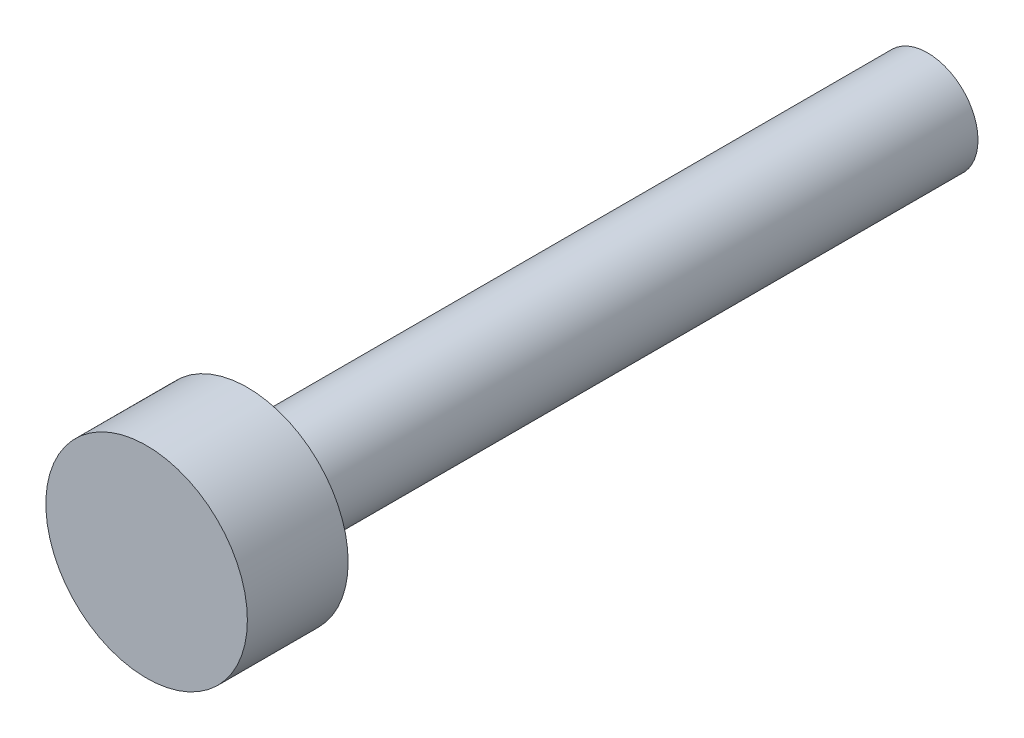
ISO-10303-21;
HEADER;
FILE_DESCRIPTION(('STEP AP214'),'2;1');
FILE_NAME('part.step','',(''),(''),'','','');
FILE_SCHEMA(('AUTOMOTIVE_DESIGN { 1 0 10303 214 1 1 1 1 }'));
ENDSEC;
DATA;
#1=APPLICATION_CONTEXT('core data for automotive mechanical design processes');
#2=APPLICATION_PROTOCOL_DEFINITION('international standard','automotive_design',2000,#1);
#3=PRODUCT_CONTEXT('',#1,'mechanical');
#4=PRODUCT('Part','Part','',(#3));
#5=PRODUCT_RELATED_PRODUCT_CATEGORY('part','',(#4));
#6=PRODUCT_DEFINITION_FORMATION('','',#4);
#7=PRODUCT_DEFINITION_CONTEXT('part definition',#1,'design');
#8=PRODUCT_DEFINITION('design','',#6,#7);
#9=PRODUCT_DEFINITION_SHAPE('','',#8);
#10=(LENGTH_UNIT() NAMED_UNIT(*) SI_UNIT(.MILLI.,.METRE.));
#11=(NAMED_UNIT(*) PLANE_ANGLE_UNIT() SI_UNIT($,.RADIAN.));
#12=(NAMED_UNIT(*) SI_UNIT($,.STERADIAN.) SOLID_ANGLE_UNIT());
#13=UNCERTAINTY_MEASURE_WITH_UNIT(LENGTH_MEASURE(1.E-05),#10,'distance_accuracy_value','');
#14=(GEOMETRIC_REPRESENTATION_CONTEXT(3) GLOBAL_UNCERTAINTY_ASSIGNED_CONTEXT((#13)) GLOBAL_UNIT_ASSIGNED_CONTEXT((#10,
#11,#12)) REPRESENTATION_CONTEXT('',''));
#15=CARTESIAN_POINT('',(0.,0.,0.));
#16=DIRECTION('',(0.,0.,1.));
#17=DIRECTION('',(1.,0.,0.));
#18=AXIS2_PLACEMENT_3D('',#15,#16,#17);
#19=CARTESIAN_POINT('',(0.,0.,27.));
#20=DIRECTION('',(0.,0.,-1.));
#21=DIRECTION('',(-1.,0.,0.));
#22=AXIS2_PLACEMENT_3D('',#19,#20,#21);
#23=CYLINDRICAL_SURFACE('',#22,2.);
#24=CARTESIAN_POINT('',(0.,0.,27.));
#25=DIRECTION('',(0.,0.,1.));
#26=DIRECTION('',(1.,0.,0.));
#27=AXIS2_PLACEMENT_3D('',#24,#25,#26);
#28=CIRCLE('',#27,2.);
#29=CARTESIAN_POINT('',(2.,0.,27.));
#30=VERTEX_POINT('',#29);
#31=EDGE_CURVE('E10',#30,#30,#28,.T.);
#32=ORIENTED_EDGE('',*,*,#31,.F.);
#33=EDGE_LOOP('',(#32));
#34=FACE_BOUND('',#33,.T.);
#35=CARTESIAN_POINT('',(0.,0.,0.));
#36=DIRECTION('',(0.,0.,1.));
#37=DIRECTION('',(1.,0.,0.));
#38=AXIS2_PLACEMENT_3D('',#35,#36,#37);
#39=CIRCLE('',#38,2.);
#40=CARTESIAN_POINT('',(2.,0.,0.));
#41=VERTEX_POINT('',#40);
#42=EDGE_CURVE('E34',#41,#41,#39,.T.);
#43=ORIENTED_EDGE('',*,*,#42,.T.);
#44=EDGE_LOOP('',(#43));
#45=FACE_BOUND('',#44,.T.);
#46=ADVANCED_FACE('F31',(#34,#45),#23,.T.);
#47=CARTESIAN_POINT('',(0.,0.,0.));
#48=DIRECTION('',(0.,0.,1.));
#49=DIRECTION('',(1.,0.,0.));
#50=AXIS2_PLACEMENT_3D('',#47,#48,#49);
#51=PLANE('',#50);
#52=ORIENTED_EDGE('',*,*,#42,.F.);
#53=EDGE_LOOP('',(#52));
#54=FACE_BOUND('',#53,.T.);
#55=ADVANCED_FACE('F59',(#54),#51,.F.);
#56=CARTESIAN_POINT('',(0.,0.,27.));
#57=DIRECTION('',(0.,0.,1.));
#58=DIRECTION('',(1.,0.,0.));
#59=AXIS2_PLACEMENT_3D('',#56,#57,#58);
#60=PLANE('',#59);
#61=CARTESIAN_POINT('',(0.,0.,27.));
#62=DIRECTION('',(0.,0.,1.));
#63=DIRECTION('',(1.,0.,0.));
#64=AXIS2_PLACEMENT_3D('',#61,#62,#63);
#65=CIRCLE('',#64,4.);
#66=CARTESIAN_POINT('',(4.,0.,27.));
#67=VERTEX_POINT('',#66);
#68=EDGE_CURVE('E43',#67,#67,#65,.T.);
#69=ORIENTED_EDGE('',*,*,#68,.F.);
#70=EDGE_LOOP('',(#69));
#71=FACE_BOUND('',#70,.T.);
#72=ORIENTED_EDGE('',*,*,#31,.T.);
#73=EDGE_LOOP('',(#72));
#74=FACE_BOUND('',#73,.T.);
#75=ADVANCED_FACE('F54',(#71,#74),#60,.F.);
#76=CARTESIAN_POINT('',(0.,0.,31.));
#77=DIRECTION('',(0.,0.,-1.));
#78=DIRECTION('',(-1.,0.,0.));
#79=AXIS2_PLACEMENT_3D('',#76,#77,#78);
#80=CYLINDRICAL_SURFACE('',#79,4.);
#81=CARTESIAN_POINT('',(0.,0.,31.));
#82=DIRECTION('',(0.,0.,1.));
#83=DIRECTION('',(1.,0.,0.));
#84=AXIS2_PLACEMENT_3D('',#81,#82,#83);
#85=CIRCLE('',#84,4.);
#86=CARTESIAN_POINT('',(4.,0.,31.));
#87=VERTEX_POINT('',#86);
#88=EDGE_CURVE('E41',#87,#87,#85,.T.);
#89=ORIENTED_EDGE('',*,*,#88,.F.);
#90=EDGE_LOOP('',(#89));
#91=FACE_BOUND('',#90,.T.);
#92=ORIENTED_EDGE('',*,*,#68,.T.);
#93=EDGE_LOOP('',(#92));
#94=FACE_BOUND('',#93,.T.);
#95=ADVANCED_FACE('F51',(#91,#94),#80,.T.);
#96=CARTESIAN_POINT('',(0.,0.,31.));
#97=DIRECTION('',(0.,0.,1.));
#98=DIRECTION('',(1.,0.,0.));
#99=AXIS2_PLACEMENT_3D('',#96,#97,#98);
#100=PLANE('',#99);
#101=ORIENTED_EDGE('',*,*,#88,.T.);
#102=EDGE_LOOP('',(#101));
#103=FACE_BOUND('',#102,.T.);
#104=ADVANCED_FACE('F49',(#103),#100,.T.);
#105=CLOSED_SHELL('',(#46,#55,#75,#95,#104));
#106=MANIFOLD_SOLID_BREP('B2',#105);
#107=ADVANCED_BREP_SHAPE_REPRESENTATION('',(#18,#106),#14);
#108=SHAPE_DEFINITION_REPRESENTATION(#9,#107);
ENDSEC;
END-ISO-10303-21;
